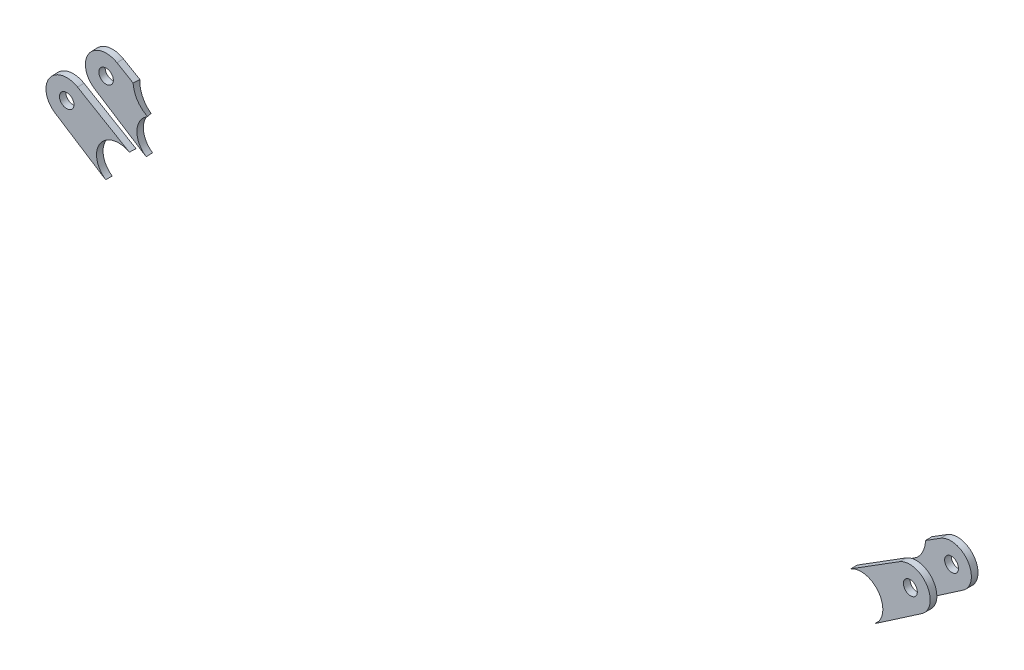
ISO-10303-21;
HEADER;
FILE_DESCRIPTION(('STEP AP214'),'2;1');
FILE_NAME('part.step','',(''),(''),'','','');
FILE_SCHEMA(('AUTOMOTIVE_DESIGN { 1 0 10303 214 1 1 1 1 }'));
ENDSEC;
DATA;
#1=APPLICATION_CONTEXT('core data for automotive mechanical design processes');
#2=APPLICATION_PROTOCOL_DEFINITION('international standard','automotive_design',2000,#1);
#3=PRODUCT_CONTEXT('',#1,'mechanical');
#4=PRODUCT('Part','Part','',(#3));
#5=PRODUCT_RELATED_PRODUCT_CATEGORY('part','',(#4));
#6=PRODUCT_DEFINITION_FORMATION('','',#4);
#7=PRODUCT_DEFINITION_CONTEXT('part definition',#1,'design');
#8=PRODUCT_DEFINITION('design','',#6,#7);
#9=PRODUCT_DEFINITION_SHAPE('','',#8);
#10=(LENGTH_UNIT() NAMED_UNIT(*) SI_UNIT(.MILLI.,.METRE.));
#11=(NAMED_UNIT(*) PLANE_ANGLE_UNIT() SI_UNIT($,.RADIAN.));
#12=(NAMED_UNIT(*) SI_UNIT($,.STERADIAN.) SOLID_ANGLE_UNIT());
#13=UNCERTAINTY_MEASURE_WITH_UNIT(LENGTH_MEASURE(1.E-05),#10,'distance_accuracy_value','');
#14=(GEOMETRIC_REPRESENTATION_CONTEXT(3) GLOBAL_UNCERTAINTY_ASSIGNED_CONTEXT((#13)) GLOBAL_UNIT_ASSIGNED_CONTEXT((#10,
#11,#12)) REPRESENTATION_CONTEXT('',''));
#15=CARTESIAN_POINT('',(0.,0.,0.));
#16=DIRECTION('',(0.,0.,1.));
#17=DIRECTION('',(1.,0.,0.));
#18=AXIS2_PLACEMENT_3D('',#15,#16,#17);
#19=CARTESIAN_POINT('',(-249.692555395701,-2230.20496306954,145.84507016795));
#20=DIRECTION('',(-0.0221981663765211,0.0147987775843204,-0.999644055447503));
#21=DIRECTION('',(0.999753536362772,0.,-0.0222005975174446));
#22=AXIS2_PLACEMENT_3D('',#19,#20,#21);
#23=PLANE('',#22);
#24=CARTESIAN_POINT('',(-220.000000000002,-2250.,144.892668532151));
#25=DIRECTION('',(0.0221981663765211,-0.0147987775843204,0.999644055447503));
#26=DIRECTION('',(-0.831754130568251,0.554502753711993,0.0266788756972608));
#27=AXIS2_PLACEMENT_3D('',#24,#25,#26);
#28=ELLIPSE('',#27,12.7045221054355,12.7);
#29=CARTESIAN_POINT('',(-227.594962639426,-2260.17872990632,144.910636412039));
#30=VERTEX_POINT('',#29);
#31=CARTESIAN_POINT('',(-213.525388794002,-2239.07436913807,144.91063641204));
#32=VERTEX_POINT('',#31);
#33=EDGE_CURVE('E59',#30,#32,#28,.F.);
#34=ORIENTED_EDGE('',*,*,#33,.T.);
#35=DIRECTION('',(0.842362845825228,-0.538250259314545,-0.0266738508852436));
#36=VECTOR('',#35,1.);
#37=CARTESIAN_POINT('',(-212.854050224362,-2239.50333886411,144.889378132441));
#38=LINE('',#37,#36);
#39=CARTESIAN_POINT('',(-243.23111444626,-2220.09310160627,145.851283427056));
#40=VERTEX_POINT('',#39);
#41=EDGE_CURVE('E92',#40,#32,#38,.T.);
#42=ORIENTED_EDGE('',*,*,#41,.F.);
#43=CARTESIAN_POINT('',(-249.692555395701,-2230.20496306954,145.84507016795));
#44=DIRECTION('',(-0.0221981663765211,0.0147987775843204,-0.999644055447503));
#45=DIRECTION('',(0.999753536362772,0.,-0.0222005975174446));
#46=AXIS2_PLACEMENT_3D('',#43,#44,#45);
#47=CIRCLE('',#46,12.0000000000003);
#48=CARTESIAN_POINT('',(-256.541411765852,-2240.05854758567,145.851283427057));
#49=VERTEX_POINT('',#48);
#50=EDGE_CURVE('E98',#49,#40,#47,.T.);
#51=ORIENTED_EDGE('',*,*,#50,.F.);
#52=DIRECTION('',(-0.820832103146355,0.570546373332864,0.0266738508852429));
#53=VECTOR('',#52,1.);
#54=CARTESIAN_POINT('',(-226.940783442501,-2260.63343869132,144.889378132441));
#55=LINE('',#54,#53);
#56=EDGE_CURVE('E103',#30,#49,#55,.T.);
#57=ORIENTED_EDGE('',*,*,#56,.F.);
#58=EDGE_LOOP('',(#34,#42,#51,#57));
#59=FACE_BOUND('',#58,.T.);
#60=CARTESIAN_POINT('',(-249.692555395701,-2230.20496306954,145.84507016795));
#61=DIRECTION('',(-0.0221981663765211,0.0147987775843204,-0.999644055447503));
#62=DIRECTION('',(-0.999753536362772,0.,0.0222005975174446));
#63=AXIS2_PLACEMENT_3D('',#60,#61,#62);
#64=CIRCLE('',#63,4.19999999999987);
#65=CARTESIAN_POINT('',(-253.891520248424,-2230.20496306954,145.938312677523));
#66=VERTEX_POINT('',#65);
#67=EDGE_CURVE('E104',#66,#66,#64,.T.);
#68=ORIENTED_EDGE('',*,*,#67,.T.);
#69=EDGE_LOOP('',(#68));
#70=FACE_BOUND('',#69,.T.);
#71=ADVANCED_FACE('F50',(#59,#70),#23,.F.);
#72=CARTESIAN_POINT('',(-249.77801833625,-2230.14798777584,141.996440554477));
#73=DIRECTION('',(-0.0221981663765211,0.0147987775843204,-0.999644055447503));
#74=DIRECTION('',(0.999753536362772,0.,-0.0222005975174446));
#75=AXIS2_PLACEMENT_3D('',#72,#73,#74);
#76=PLANE('',#75);
#77=DIRECTION('',(-0.820832103146355,0.570546373332864,0.0266738508852429));
#78=VECTOR('',#77,1.);
#79=CARTESIAN_POINT('',(-227.026246383051,-2260.57646339762,141.040748518969));
#80=LINE('',#79,#78);
#81=CARTESIAN_POINT('',(-227.543459904994,-2260.21695711363,141.05755594683));
#82=VERTEX_POINT('',#81);
#83=CARTESIAN_POINT('',(-256.626874706401,-2240.00157229197,142.002653813584));
#84=VERTEX_POINT('',#83);
#85=EDGE_CURVE('E113',#82,#84,#80,.T.);
#86=ORIENTED_EDGE('',*,*,#85,.T.);
#87=CARTESIAN_POINT('',(-249.77801833625,-2230.14798777584,141.996440554477));
#88=DIRECTION('',(-0.0221981663765211,0.0147987775843204,-0.999644055447503));
#89=DIRECTION('',(0.999753536362772,0.,-0.0222005975174446));
#90=AXIS2_PLACEMENT_3D('',#87,#88,#89);
#91=CIRCLE('',#90,12.0000000000003);
#92=CARTESIAN_POINT('',(-243.316577386809,-2220.03612631257,142.002653813583));
#93=VERTEX_POINT('',#92);
#94=EDGE_CURVE('E118',#84,#93,#91,.T.);
#95=ORIENTED_EDGE('',*,*,#94,.T.);
#96=DIRECTION('',(0.842362845825228,-0.538250259314545,-0.0266738508852436));
#97=VECTOR('',#96,1.);
#98=CARTESIAN_POINT('',(-212.939513164911,-2239.44636357041,141.040748518968));
#99=LINE('',#98,#97);
#100=CARTESIAN_POINT('',(-213.470293397096,-2239.10720735165,141.057555946832));
#101=VERTEX_POINT('',#100);
#102=EDGE_CURVE('E109',#93,#101,#99,.T.);
#103=ORIENTED_EDGE('',*,*,#102,.T.);
#104=CARTESIAN_POINT('',(-220.000000000002,-2250.,141.041297657668));
#105=DIRECTION('',(0.0221981663765211,-0.0147987775843204,0.999644055447503));
#106=DIRECTION('',(-0.831754130568251,0.554502753711993,0.0266788756972608));
#107=AXIS2_PLACEMENT_3D('',#104,#105,#106);
#108=ELLIPSE('',#107,12.7045221054355,12.7);
#109=EDGE_CURVE('E53',#82,#101,#108,.F.);
#110=ORIENTED_EDGE('',*,*,#109,.F.);
#111=EDGE_LOOP('',(#86,#95,#103,#110));
#112=FACE_BOUND('',#111,.T.);
#113=CARTESIAN_POINT('',(-249.77801833625,-2230.14798777584,141.996440554477));
#114=DIRECTION('',(-0.0221981663765211,0.0147987775843204,-0.999644055447503));
#115=DIRECTION('',(-0.999753536362772,0.,0.0222005975174446));
#116=AXIS2_PLACEMENT_3D('',#113,#114,#115);
#117=CIRCLE('',#116,4.19999999999987);
#118=CARTESIAN_POINT('',(-253.976983188974,-2230.14798777584,142.08968306405));
#119=VERTEX_POINT('',#118);
#120=EDGE_CURVE('E110',#119,#119,#117,.T.);
#121=ORIENTED_EDGE('',*,*,#120,.F.);
#122=EDGE_LOOP('',(#121));
#123=FACE_BOUND('',#122,.T.);
#124=ADVANCED_FACE('F131',(#112,#123),#76,.T.);
#125=CARTESIAN_POINT('',(-226.940783442501,-2260.63343869132,144.889378132441));
#126=DIRECTION('',(0.570738030845897,0.821132043010578,-0.00051777159223074));
#127=DIRECTION('',(0.821132153078187,-0.570738107349756,0.));
#128=AXIS2_PLACEMENT_3D('',#125,#126,#127);
#129=PLANE('',#128);
#130=CARTESIAN_POINT('',(-219.999999999745,-2249.99999999963,24659.22446767));
#131=DIRECTION('',(-0.570738030845897,-0.821132043010578,0.00051777159223074));
#132=DIRECTION('',(0.000295511978589142,0.000425158902331218,0.99999986595628));
#133=AXIS2_PLACEMENT_3D('',#130,#131,#132);
#134=ELLIPSE('',#133,24528.1900185729,12.7);
#135=EDGE_CURVE('E66',#82,#30,#134,.F.);
#136=ORIENTED_EDGE('',*,*,#135,.T.);
#137=ORIENTED_EDGE('',*,*,#56,.T.);
#138=DIRECTION('',(-0.0221981663765211,0.0147987775843204,-0.999644055447503));
#139=VECTOR('',#138,1.);
#140=CARTESIAN_POINT('',(-256.541411765852,-2240.05854758567,145.851283427057));
#141=LINE('',#140,#139);
#142=EDGE_CURVE('E121',#49,#84,#141,.T.);
#143=ORIENTED_EDGE('',*,*,#142,.T.);
#144=ORIENTED_EDGE('',*,*,#85,.F.);
#145=EDGE_LOOP('',(#136,#137,#143,#144));
#146=FACE_BOUND('',#145,.T.);
#147=ADVANCED_FACE('F127',(#146),#129,.F.);
#148=CARTESIAN_POINT('',(-249.692555395701,-2230.20496306954,145.84507016795));
#149=DIRECTION('',(-0.0221981663765211,0.0147987775843204,-0.999644055447503));
#150=DIRECTION('',(0.999753536362772,0.,-0.0222005975174446));
#151=AXIS2_PLACEMENT_3D('',#148,#149,#150);
#152=CYLINDRICAL_SURFACE('',#151,12.0000000000003);
#153=ORIENTED_EDGE('',*,*,#94,.F.);
#154=ORIENTED_EDGE('',*,*,#142,.F.);
#155=ORIENTED_EDGE('',*,*,#50,.T.);
#156=DIRECTION('',(-0.0221981663765211,0.0147987775843204,-0.999644055447503));
#157=VECTOR('',#156,1.);
#158=CARTESIAN_POINT('',(-243.23111444626,-2220.09310160627,145.851283427056));
#159=LINE('',#158,#157);
#160=EDGE_CURVE('E94',#40,#93,#159,.T.);
#161=ORIENTED_EDGE('',*,*,#160,.T.);
#162=EDGE_LOOP('',(#153,#154,#155,#161));
#163=FACE_BOUND('',#162,.T.);
#164=ADVANCED_FACE('F129',(#163),#152,.T.);
#165=CARTESIAN_POINT('',(-212.854050224362,-2239.50333886411,144.889378132441));
#166=DIRECTION('',(-0.53845341245343,-0.842655121938884,-0.000517771592192865));
#167=DIRECTION('',(-0.842655234891526,0.538453484629738,0.));
#168=AXIS2_PLACEMENT_3D('',#165,#166,#167);
#169=PLANE('',#168);
#170=CARTESIAN_POINT('',(-219.999999999745,-2249.99999999963,24659.2244677046));
#171=DIRECTION('',(0.53845341245343,0.842655121938884,0.000517771592192865));
#172=DIRECTION('',(-0.000278795918058033,-0.00043630294263976,0.99999986595628));
#173=AXIS2_PLACEMENT_3D('',#170,#171,#172);
#174=ELLIPSE('',#173,24528.1900186114,12.7);
#175=EDGE_CURVE('E12',#32,#101,#174,.F.);
#176=ORIENTED_EDGE('',*,*,#175,.T.);
#177=ORIENTED_EDGE('',*,*,#102,.F.);
#178=ORIENTED_EDGE('',*,*,#160,.F.);
#179=ORIENTED_EDGE('',*,*,#41,.T.);
#180=EDGE_LOOP('',(#176,#177,#178,#179));
#181=FACE_BOUND('',#180,.T.);
#182=ADVANCED_FACE('F93',(#181),#169,.F.);
#183=CARTESIAN_POINT('',(-249.692555395701,-2230.20496306954,145.84507016795));
#184=DIRECTION('',(-0.0221981663765211,0.0147987775843204,-0.999644055447503));
#185=DIRECTION('',(0.999753536362772,0.,-0.0222005975174446));
#186=AXIS2_PLACEMENT_3D('',#183,#184,#185);
#187=CYLINDRICAL_SURFACE('',#186,4.19999999999987);
#188=ORIENTED_EDGE('',*,*,#67,.F.);
#189=EDGE_LOOP('',(#188));
#190=FACE_BOUND('',#189,.T.);
#191=ORIENTED_EDGE('',*,*,#120,.T.);
#192=EDGE_LOOP('',(#191));
#193=FACE_BOUND('',#192,.T.);
#194=ADVANCED_FACE('F136',(#190,#193),#187,.F.);
#195=CARTESIAN_POINT('',(-220.000000000002,-2250.,80.000000000002));
#196=DIRECTION('',(0.,0.,1.));
#197=DIRECTION('',(0.,-1.,0.));
#198=AXIS2_PLACEMENT_3D('',#195,#196,#197);
#199=CYLINDRICAL_SURFACE('',#198,12.7);
#200=ORIENTED_EDGE('',*,*,#135,.F.);
#201=ORIENTED_EDGE('',*,*,#109,.T.);
#202=ORIENTED_EDGE('',*,*,#175,.F.);
#203=ORIENTED_EDGE('',*,*,#33,.F.);
#204=EDGE_LOOP('',(#200,#201,#202,#203));
#205=FACE_BOUND('',#204,.T.);
#206=ADVANCED_FACE('F86',(#205),#199,.F.);
#207=CLOSED_SHELL('',(#71,#124,#147,#164,#182,#194,#206));
#208=MANIFOLD_SOLID_BREP('B2',#207);
#209=CARTESIAN_POINT('',(-250.30744460433,-2229.79503693046,118.154929832054));
#210=DIRECTION('',(0.0221981663765211,-0.0147987775843204,0.999644055447503));
#211=DIRECTION('',(-0.999753536362772,0.,0.0222005975174446));
#212=AXIS2_PLACEMENT_3D('',#209,#210,#211);
#213=CYLINDRICAL_SURFACE('',#212,4.19999999999987);
#214=CARTESIAN_POINT('',(-250.30744460433,-2229.79503693046,118.154929832054));
#215=DIRECTION('',(-0.0221981663765211,0.0147987775843204,-0.999644055447503));
#216=DIRECTION('',(-0.999753536362772,0.,0.0222005975174446));
#217=AXIS2_PLACEMENT_3D('',#214,#215,#216);
#218=CIRCLE('',#217,4.19999999999987);
#219=CARTESIAN_POINT('',(-254.506409457054,-2229.79503693046,118.248172341627));
#220=VERTEX_POINT('',#219);
#221=EDGE_CURVE('E268',#220,#220,#218,.T.);
#222=ORIENTED_EDGE('',*,*,#221,.T.);
#223=EDGE_LOOP('',(#222));
#224=FACE_BOUND('',#223,.T.);
#225=CARTESIAN_POINT('',(-250.221981663781,-2229.85201222416,122.003559445527));
#226=DIRECTION('',(-0.0221981663765211,0.0147987775843204,-0.999644055447503));
#227=DIRECTION('',(-0.999753536362772,0.,0.0222005975174446));
#228=AXIS2_PLACEMENT_3D('',#225,#226,#227);
#229=CIRCLE('',#228,4.19999999999987);
#230=CARTESIAN_POINT('',(-254.420946516504,-2229.85201222416,122.0968019551));
#231=VERTEX_POINT('',#230);
#232=EDGE_CURVE('E294',#231,#231,#229,.T.);
#233=ORIENTED_EDGE('',*,*,#232,.F.);
#234=EDGE_LOOP('',(#233));
#235=FACE_BOUND('',#234,.T.);
#236=ADVANCED_FACE('F207',(#224,#235),#213,.F.);
#237=CARTESIAN_POINT('',(-250.30744460433,-2229.79503693046,118.154929832054));
#238=DIRECTION('',(0.0221981663765211,-0.0147987775843204,0.999644055447503));
#239=DIRECTION('',(-0.999753536362772,0.,0.0222005975174446));
#240=AXIS2_PLACEMENT_3D('',#237,#238,#239);
#241=CYLINDRICAL_SURFACE('',#240,12.0000000000003);
#242=CARTESIAN_POINT('',(-250.221981663781,-2229.85201222416,122.003559445527));
#243=DIRECTION('',(-0.0221981663765211,0.0147987775843204,-0.999644055447503));
#244=DIRECTION('',(0.999753536362772,0.,-0.0222005975174446));
#245=AXIS2_PLACEMENT_3D('',#242,#243,#244);
#246=CIRCLE('',#245,12.0000000000003);
#247=CARTESIAN_POINT('',(-257.070838033932,-2239.70559674028,122.009772704634));
#248=VERTEX_POINT('',#247);
#249=CARTESIAN_POINT('',(-243.76054071434,-2219.74015076089,122.009772704633));
#250=VERTEX_POINT('',#249);
#251=EDGE_CURVE('E262',#248,#250,#246,.T.);
#252=ORIENTED_EDGE('',*,*,#251,.T.);
#253=DIRECTION('',(0.0221981663765211,-0.0147987775843204,0.999644055447503));
#254=VECTOR('',#253,1.);
#255=CARTESIAN_POINT('',(-243.846003654889,-2219.68317546719,118.16114309116));
#256=LINE('',#255,#254);
#257=CARTESIAN_POINT('',(-243.846003654889,-2219.68317546719,118.16114309116));
#258=VERTEX_POINT('',#257);
#259=EDGE_CURVE('E271',#258,#250,#256,.T.);
#260=ORIENTED_EDGE('',*,*,#259,.F.);
#261=CARTESIAN_POINT('',(-250.30744460433,-2229.79503693046,118.154929832054));
#262=DIRECTION('',(-0.0221981663765211,0.0147987775843204,-0.999644055447503));
#263=DIRECTION('',(0.999753536362772,0.,-0.0222005975174446));
#264=AXIS2_PLACEMENT_3D('',#261,#262,#263);
#265=CIRCLE('',#264,12.0000000000003);
#266=CARTESIAN_POINT('',(-257.156300974481,-2239.64862144658,118.161143091161));
#267=VERTEX_POINT('',#266);
#268=EDGE_CURVE('E279',#267,#258,#265,.T.);
#269=ORIENTED_EDGE('',*,*,#268,.F.);
#270=DIRECTION('',(0.0221981663765211,-0.0147987775843204,0.999644055447503));
#271=VECTOR('',#270,1.);
#272=CARTESIAN_POINT('',(-257.156300974481,-2239.64862144658,118.161143091161));
#273=LINE('',#272,#271);
#274=EDGE_CURVE('E284',#267,#248,#273,.T.);
#275=ORIENTED_EDGE('',*,*,#274,.T.);
#276=EDGE_LOOP('',(#252,#260,#269,#275));
#277=FACE_BOUND('',#276,.T.);
#278=ADVANCED_FACE('F282',(#277),#241,.T.);
#279=CARTESIAN_POINT('',(-227.555672651131,-2260.22351255224,117.199237796546));
#280=DIRECTION('',(-0.570738030845897,-0.821132043010578,0.00051777159223074));
#281=DIRECTION('',(-0.821132153078187,0.570738107349756,0.));
#282=AXIS2_PLACEMENT_3D('',#279,#280,#281);
#283=PLANE('',#282);
#284=DIRECTION('',(-0.820832103146355,0.570546373332864,0.0266738508852429));
#285=VECTOR('',#284,1.);
#286=CARTESIAN_POINT('',(-227.470209710581,-2260.28048784594,121.047867410019));
#287=LINE('',#286,#285);
#288=CARTESIAN_POINT('',(-227.470209710581,-2260.28048784594,121.047867410019));
#289=VERTEX_POINT('',#288);
#290=EDGE_CURVE('E285',#289,#248,#287,.T.);
#291=ORIENTED_EDGE('',*,*,#290,.T.);
#292=ORIENTED_EDGE('',*,*,#274,.F.);
#293=DIRECTION('',(-0.820832103146355,0.570546373332864,0.0266738508852429));
#294=VECTOR('',#293,1.);
#295=CARTESIAN_POINT('',(-227.555672651131,-2260.22351255224,117.199237796546));
#296=LINE('',#295,#294);
#297=CARTESIAN_POINT('',(-227.555672651131,-2260.22351255224,117.199237796546));
#298=VERTEX_POINT('',#297);
#299=EDGE_CURVE('E278',#298,#267,#296,.T.);
#300=ORIENTED_EDGE('',*,*,#299,.F.);
#301=DIRECTION('',(0.0221981663765211,-0.0147987775843204,0.999644055447503));
#302=VECTOR('',#301,1.);
#303=CARTESIAN_POINT('',(-227.555672651131,-2260.22351255224,117.199237796546));
#304=LINE('',#303,#302);
#305=EDGE_CURVE('E305',#298,#289,#304,.T.);
#306=ORIENTED_EDGE('',*,*,#305,.T.);
#307=EDGE_LOOP('',(#291,#292,#300,#306));
#308=FACE_BOUND('',#307,.T.);
#309=ADVANCED_FACE('F314',(#308),#283,.T.);
#310=CARTESIAN_POINT('',(-213.468939432992,-2239.09341272502,117.199237796545));
#311=DIRECTION('',(0.53845341245343,0.842655121938884,0.000517771592192865));
#312=DIRECTION('',(0.842655234891526,-0.538453484629738,0.));
#313=AXIS2_PLACEMENT_3D('',#310,#311,#312);
#314=PLANE('',#313);
#315=DIRECTION('',(0.842362845825228,-0.538250259314545,-0.0266738508852436));
#316=VECTOR('',#315,1.);
#317=CARTESIAN_POINT('',(-213.468939432992,-2239.09341272502,117.199237796545));
#318=LINE('',#317,#316);
#319=CARTESIAN_POINT('',(-234.35356322023,-2225.74862404532,117.860560103739));
#320=VERTEX_POINT('',#319);
#321=EDGE_CURVE('E274',#258,#320,#318,.T.);
#322=ORIENTED_EDGE('',*,*,#321,.F.);
#323=ORIENTED_EDGE('',*,*,#259,.T.);
#324=DIRECTION('',(0.842362845825228,-0.538250259314545,-0.0266738508852436));
#325=VECTOR('',#324,1.);
#326=CARTESIAN_POINT('',(-213.383476492442,-2239.15038801872,121.047867410018));
#327=LINE('',#326,#325);
#328=CARTESIAN_POINT('',(-234.537538003419,-2225.63343490253,121.717721600712));
#329=VERTEX_POINT('',#328);
#330=EDGE_CURVE('E256',#250,#329,#327,.T.);
#331=ORIENTED_EDGE('',*,*,#330,.T.);
#332=CARTESIAN_POINT('',(-221.173046047443,-2234.16387835954,106.393536067434));
#333=DIRECTION('',(-0.53845341245343,-0.842655121938884,-0.000517771592192865));
#334=DIRECTION('',(-0.286116415927992,0.182249282179549,0.940703245280657));
#335=AXIS2_PLACEMENT_3D('',#332,#333,#334);
#336=ELLIPSE('',#335,30.7382771438212,12.7);
#337=EDGE_CURVE('E292',#320,#329,#336,.F.);
#338=ORIENTED_EDGE('',*,*,#337,.F.);
#339=EDGE_LOOP('',(#322,#323,#331,#338));
#340=FACE_BOUND('',#339,.T.);
#341=ADVANCED_FACE('F272',(#340),#314,.T.);
#342=CARTESIAN_POINT('',(-220.000000000002,-2250.,80.000000000002));
#343=DIRECTION('',(-0.0380831501247217,0.514122526683866,0.856870877806438));
#344=DIRECTION('',(0.,-0.857492925712543,0.514495755427529));
#345=AXIS2_PLACEMENT_3D('',#342,#343,#344);
#346=CYLINDRICAL_SURFACE('',#345,12.7);
#347=CARTESIAN_POINT('',(-220.000000000002,-2250.,80.000000000002));
#348=DIRECTION('',(0.0711793246382173,-0.96092088261587,0.26751553430929));
#349=DIRECTION('',(-0.0197618234209458,0.266784616182913,0.963553547501754));
#350=AXIS2_PLACEMENT_3D('',#347,#348,#349);
#351=ELLIPSE('',#350,47.4738786021954,12.7);
#352=CARTESIAN_POINT('',(-228.019620704173,-2240.15237674557,117.506674297633));
#353=VERTEX_POINT('',#352);
#354=CARTESIAN_POINT('',(-226.27157061495,-2238.95656747104,121.336930665293));
#355=VERTEX_POINT('',#354);
#356=EDGE_CURVE('E211',#353,#355,#351,.F.);
#357=ORIENTED_EDGE('',*,*,#356,.F.);
#358=CARTESIAN_POINT('',(-221.669041506267,-2227.46793966542,117.553433890964));
#359=DIRECTION('',(0.0221981663765211,-0.0147987775843204,0.999644055447503));
#360=DIRECTION('',(-0.107413892332197,0.994067299440669,0.0171014594927545));
#361=AXIS2_PLACEMENT_3D('',#358,#359,#360);
#362=ELLIPSE('',#361,14.9744352504567,12.7);
#363=EDGE_CURVE('E217',#353,#320,#362,.F.);
#364=ORIENTED_EDGE('',*,*,#363,.T.);
#365=ORIENTED_EDGE('',*,*,#337,.T.);
#366=CARTESIAN_POINT('',(-221.841919743499,-2225.13408346278,121.443194228696));
#367=DIRECTION('',(0.0221981663765211,-0.0147987775843204,0.999644055447503));
#368=DIRECTION('',(-0.107413892332197,0.994067299440669,0.0171014594927545));
#369=AXIS2_PLACEMENT_3D('',#366,#367,#368);
#370=ELLIPSE('',#369,14.9744352504567,12.7);
#371=EDGE_CURVE('E264',#355,#329,#370,.F.);
#372=ORIENTED_EDGE('',*,*,#371,.F.);
#373=EDGE_LOOP('',(#357,#364,#365,#372));
#374=FACE_BOUND('',#373,.T.);
#375=ADVANCED_FACE('F324',(#374),#346,.F.);
#376=CARTESIAN_POINT('',(-213.468939432992,-2239.09341272502,117.199237796545));
#377=DIRECTION('',(0.83175413056825,-0.554502753711994,-0.0266788756972608));
#378=DIRECTION('',(-0.554700196225109,-0.832050294337924,0.));
#379=AXIS2_PLACEMENT_3D('',#376,#377,#378);
#380=PLANE('',#379);
#381=DIRECTION('',(-0.554700196225109,-0.832050294337924,0.));
#382=VECTOR('',#381,1.);
#383=CARTESIAN_POINT('',(-213.383476492442,-2239.15038801872,121.047867410018));
#384=LINE('',#383,#382);
#385=CARTESIAN_POINT('',(-227.465785972235,-2260.27385223842,121.047867410019));
#386=VERTEX_POINT('',#385);
#387=EDGE_CURVE('E287',#386,#289,#384,.T.);
#388=ORIENTED_EDGE('',*,*,#387,.T.);
#389=ORIENTED_EDGE('',*,*,#305,.F.);
#390=DIRECTION('',(-0.554700196225109,-0.832050294337924,0.));
#391=VECTOR('',#390,1.);
#392=CARTESIAN_POINT('',(-213.468939432992,-2239.09341272502,117.199237796545));
#393=LINE('',#392,#391);
#394=CARTESIAN_POINT('',(-227.548714539188,-2260.21307538432,117.199237796546));
#395=VERTEX_POINT('',#394);
#396=EDGE_CURVE('E307',#395,#298,#393,.T.);
#397=ORIENTED_EDGE('',*,*,#396,.F.);
#398=CARTESIAN_POINT('',(-220.000000000002,-2250.,140.269777985643));
#399=DIRECTION('',(-0.83175413056825,0.554502753711994,0.0266788756972608));
#400=DIRECTION('',(0.022198166376521,-0.0147987775843204,0.999644055447503));
#401=AXIS2_PLACEMENT_3D('',#398,#399,#400);
#402=ELLIPSE('',#401,476.032054128279,12.7);
#403=EDGE_CURVE('E302',#386,#395,#402,.F.);
#404=ORIENTED_EDGE('',*,*,#403,.F.);
#405=EDGE_LOOP('',(#388,#389,#397,#404));
#406=FACE_BOUND('',#405,.T.);
#407=ADVANCED_FACE('F209',(#406),#380,.T.);
#408=CARTESIAN_POINT('',(-250.221981663781,-2229.85201222416,122.003559445527));
#409=DIRECTION('',(-0.0221981663765211,0.0147987775843204,-0.999644055447503));
#410=DIRECTION('',(0.999753536362772,0.,-0.0222005975174446));
#411=AXIS2_PLACEMENT_3D('',#408,#409,#410);
#412=PLANE('',#411);
#413=CARTESIAN_POINT('',(-220.000000000002,-2250.,121.034176231786));
#414=DIRECTION('',(0.0221981663765211,-0.0147987775843204,0.999644055447503));
#415=DIRECTION('',(-0.831754130568251,0.554502753711993,0.0266788756972608));
#416=AXIS2_PLACEMENT_3D('',#413,#414,#415);
#417=ELLIPSE('',#416,12.7045221054355,12.7);
#418=EDGE_CURVE('E48',#386,#355,#417,.F.);
#419=ORIENTED_EDGE('',*,*,#418,.T.);
#420=ORIENTED_EDGE('',*,*,#371,.T.);
#421=ORIENTED_EDGE('',*,*,#330,.F.);
#422=ORIENTED_EDGE('',*,*,#251,.F.);
#423=ORIENTED_EDGE('',*,*,#290,.F.);
#424=ORIENTED_EDGE('',*,*,#387,.F.);
#425=EDGE_LOOP('',(#419,#420,#421,#422,#423,#424));
#426=FACE_BOUND('',#425,.T.);
#427=ORIENTED_EDGE('',*,*,#232,.T.);
#428=EDGE_LOOP('',(#427));
#429=FACE_BOUND('',#428,.T.);
#430=ADVANCED_FACE('F258',(#426,#429),#412,.F.);
#431=CARTESIAN_POINT('',(-250.30744460433,-2229.79503693046,118.154929832054));
#432=DIRECTION('',(-0.0221981663765211,0.0147987775843204,-0.999644055447503));
#433=DIRECTION('',(0.999753536362772,0.,-0.0222005975174446));
#434=AXIS2_PLACEMENT_3D('',#431,#432,#433);
#435=PLANE('',#434);
#436=ORIENTED_EDGE('',*,*,#221,.F.);
#437=EDGE_LOOP('',(#436));
#438=FACE_BOUND('',#437,.T.);
#439=ORIENTED_EDGE('',*,*,#396,.T.);
#440=ORIENTED_EDGE('',*,*,#299,.T.);
#441=ORIENTED_EDGE('',*,*,#268,.T.);
#442=ORIENTED_EDGE('',*,*,#321,.T.);
#443=ORIENTED_EDGE('',*,*,#363,.F.);
#444=CARTESIAN_POINT('',(-220.000000000002,-2250.,117.182805357303));
#445=DIRECTION('',(0.0221981663765211,-0.0147987775843204,0.999644055447503));
#446=DIRECTION('',(-0.831754130568251,0.554502753711993,0.0266788756972608));
#447=AXIS2_PLACEMENT_3D('',#444,#445,#446);
#448=ELLIPSE('',#447,12.7045221054355,12.7);
#449=EDGE_CURVE('E225',#395,#353,#448,.F.);
#450=ORIENTED_EDGE('',*,*,#449,.F.);
#451=EDGE_LOOP('',(#439,#440,#441,#442,#443,#450));
#452=FACE_BOUND('',#451,.T.);
#453=ADVANCED_FACE('F325',(#438,#452),#435,.T.);
#454=CARTESIAN_POINT('',(-220.000000000002,-2250.,80.000000000002));
#455=DIRECTION('',(0.,0.,1.));
#456=DIRECTION('',(0.,-1.,0.));
#457=AXIS2_PLACEMENT_3D('',#454,#455,#456);
#458=CYLINDRICAL_SURFACE('',#457,12.7);
#459=ORIENTED_EDGE('',*,*,#403,.T.);
#460=ORIENTED_EDGE('',*,*,#449,.T.);
#461=ORIENTED_EDGE('',*,*,#356,.T.);
#462=ORIENTED_EDGE('',*,*,#418,.F.);
#463=EDGE_LOOP('',(#459,#460,#461,#462));
#464=FACE_BOUND('',#463,.T.);
#465=ADVANCED_FACE('F320',(#464),#458,.F.);
#466=CLOSED_SHELL('',(#236,#278,#309,#341,#375,#407,#430,#453,#465));
#467=MANIFOLD_SOLID_BREP('B6',#466);
#468=CARTESIAN_POINT('',(250.30744460433,-2229.79503693046,118.154929832054));
#469=DIRECTION('',(-0.0221981663765211,-0.0147987775843204,0.999644055447503));
#470=DIRECTION('',(0.999753536362772,0.,0.0222005975174446));
#471=AXIS2_PLACEMENT_3D('',#468,#469,#470);
#472=CYLINDRICAL_SURFACE('',#471,4.19999999999987);
#473=CARTESIAN_POINT('',(250.30744460433,-2229.79503693046,118.154929832054));
#474=DIRECTION('',(-0.0221981663765211,-0.0147987775843204,0.999644055447503));
#475=DIRECTION('',(0.999753536362772,0.,0.0222005975174446));
#476=AXIS2_PLACEMENT_3D('',#473,#474,#475);
#477=CIRCLE('',#476,4.19999999999987);
#478=CARTESIAN_POINT('',(254.506409457054,-2229.79503693046,118.248172341627));
#479=VERTEX_POINT('',#478);
#480=EDGE_CURVE('E493',#479,#479,#477,.T.);
#481=ORIENTED_EDGE('',*,*,#480,.F.);
#482=EDGE_LOOP('',(#481));
#483=FACE_BOUND('',#482,.T.);
#484=CARTESIAN_POINT('',(250.221981663781,-2229.85201222416,122.003559445527));
#485=DIRECTION('',(-0.0221981663765211,-0.0147987775843204,0.999644055447503));
#486=DIRECTION('',(0.999753536362772,0.,0.0222005975174446));
#487=AXIS2_PLACEMENT_3D('',#484,#485,#486);
#488=CIRCLE('',#487,4.19999999999987);
#489=CARTESIAN_POINT('',(254.420946516504,-2229.85201222416,122.0968019551));
#490=VERTEX_POINT('',#489);
#491=EDGE_CURVE('E520',#490,#490,#488,.T.);
#492=ORIENTED_EDGE('',*,*,#491,.T.);
#493=EDGE_LOOP('',(#492));
#494=FACE_BOUND('',#493,.T.);
#495=ADVANCED_FACE('F417',(#483,#494),#472,.F.);
#496=CARTESIAN_POINT('',(250.30744460433,-2229.79503693046,118.154929832054));
#497=DIRECTION('',(-0.0221981663765211,-0.0147987775843204,0.999644055447503));
#498=DIRECTION('',(0.999753536362772,0.,0.0222005975174446));
#499=AXIS2_PLACEMENT_3D('',#496,#497,#498);
#500=CYLINDRICAL_SURFACE('',#499,12.0000000000003);
#501=CARTESIAN_POINT('',(250.221981663781,-2229.85201222416,122.003559445527));
#502=DIRECTION('',(-0.0221981663765211,-0.0147987775843204,0.999644055447503));
#503=DIRECTION('',(-0.999753536362772,0.,-0.0222005975174446));
#504=AXIS2_PLACEMENT_3D('',#501,#502,#503);
#505=CIRCLE('',#504,12.0000000000003);
#506=CARTESIAN_POINT('',(257.070838033932,-2239.70559674028,122.009772704634));
#507=VERTEX_POINT('',#506);
#508=CARTESIAN_POINT('',(243.76054071434,-2219.74015076089,122.009772704633));
#509=VERTEX_POINT('',#508);
#510=EDGE_CURVE('E470',#507,#509,#505,.T.);
#511=ORIENTED_EDGE('',*,*,#510,.F.);
#512=DIRECTION('',(-0.0221981663765211,-0.0147987775843204,0.999644055447503));
#513=VECTOR('',#512,1.);
#514=CARTESIAN_POINT('',(257.156300974481,-2239.64862144658,118.161143091161));
#515=LINE('',#514,#513);
#516=CARTESIAN_POINT('',(257.156300974481,-2239.64862144658,118.161143091161));
#517=VERTEX_POINT('',#516);
#518=EDGE_CURVE('E515',#517,#507,#515,.T.);
#519=ORIENTED_EDGE('',*,*,#518,.F.);
#520=CARTESIAN_POINT('',(250.30744460433,-2229.79503693046,118.154929832054));
#521=DIRECTION('',(-0.0221981663765211,-0.0147987775843204,0.999644055447503));
#522=DIRECTION('',(-0.999753536362772,0.,-0.0222005975174446));
#523=AXIS2_PLACEMENT_3D('',#520,#521,#522);
#524=CIRCLE('',#523,12.0000000000003);
#525=CARTESIAN_POINT('',(243.846003654889,-2219.68317546719,118.16114309116));
#526=VERTEX_POINT('',#525);
#527=EDGE_CURVE('E473',#517,#526,#524,.T.);
#528=ORIENTED_EDGE('',*,*,#527,.T.);
#529=DIRECTION('',(-0.0221981663765211,-0.0147987775843204,0.999644055447503));
#530=VECTOR('',#529,1.);
#531=CARTESIAN_POINT('',(243.846003654889,-2219.68317546719,118.16114309116));
#532=LINE('',#531,#530);
#533=EDGE_CURVE('E467',#526,#509,#532,.T.);
#534=ORIENTED_EDGE('',*,*,#533,.T.);
#535=EDGE_LOOP('',(#511,#519,#528,#534));
#536=FACE_BOUND('',#535,.T.);
#537=ADVANCED_FACE('F469',(#536),#500,.T.);
#538=CARTESIAN_POINT('',(227.555672651131,-2260.22351255224,117.199237796546));
#539=DIRECTION('',(0.570738030845897,-0.821132043010578,0.00051777159223074));
#540=DIRECTION('',(0.821132153078187,0.570738107349756,0.));
#541=AXIS2_PLACEMENT_3D('',#538,#539,#540);
#542=PLANE('',#541);
#543=DIRECTION('',(0.820832103146355,0.570546373332864,0.0266738508852429));
#544=VECTOR('',#543,1.);
#545=CARTESIAN_POINT('',(227.470209710581,-2260.28048784594,121.047867410019));
#546=LINE('',#545,#544);
#547=CARTESIAN_POINT('',(227.470209710581,-2260.28048784594,121.047867410019));
#548=VERTEX_POINT('',#547);
#549=EDGE_CURVE('E488',#548,#507,#546,.T.);
#550=ORIENTED_EDGE('',*,*,#549,.F.);
#551=DIRECTION('',(-0.0221981663765211,-0.0147987775843204,0.999644055447503));
#552=VECTOR('',#551,1.);
#553=CARTESIAN_POINT('',(227.555672651131,-2260.22351255224,117.199237796546));
#554=LINE('',#553,#552);
#555=CARTESIAN_POINT('',(227.555672651131,-2260.22351255224,117.199237796546));
#556=VERTEX_POINT('',#555);
#557=EDGE_CURVE('E503',#556,#548,#554,.T.);
#558=ORIENTED_EDGE('',*,*,#557,.F.);
#559=DIRECTION('',(0.820832103146355,0.570546373332864,0.0266738508852429));
#560=VECTOR('',#559,1.);
#561=CARTESIAN_POINT('',(227.555672651131,-2260.22351255224,117.199237796546));
#562=LINE('',#561,#560);
#563=EDGE_CURVE('E478',#556,#517,#562,.T.);
#564=ORIENTED_EDGE('',*,*,#563,.T.);
#565=ORIENTED_EDGE('',*,*,#518,.T.);
#566=EDGE_LOOP('',(#550,#558,#564,#565));
#567=FACE_BOUND('',#566,.T.);
#568=ADVANCED_FACE('F531',(#567),#542,.T.);
#569=CARTESIAN_POINT('',(213.468939432992,-2239.09341272502,117.199237796545));
#570=DIRECTION('',(-0.53845341245343,0.842655121938884,0.000517771592192865));
#571=DIRECTION('',(-0.842655234891526,-0.538453484629738,0.));
#572=AXIS2_PLACEMENT_3D('',#569,#570,#571);
#573=PLANE('',#572);
#574=DIRECTION('',(-0.842362845825228,-0.538250259314545,-0.0266738508852436));
#575=VECTOR('',#574,1.);
#576=CARTESIAN_POINT('',(213.468939432992,-2239.09341272502,117.199237796545));
#577=LINE('',#576,#575);
#578=CARTESIAN_POINT('',(234.35356322023,-2225.74862404532,117.860560103739));
#579=VERTEX_POINT('',#578);
#580=EDGE_CURVE('E504',#526,#579,#577,.T.);
#581=ORIENTED_EDGE('',*,*,#580,.T.);
#582=CARTESIAN_POINT('',(221.173046047443,-2234.16387835954,106.393536067434));
#583=DIRECTION('',(-0.53845341245343,0.842655121938884,0.000517771592192865));
#584=DIRECTION('',(0.286116415927992,0.182249282179549,0.940703245280657));
#585=AXIS2_PLACEMENT_3D('',#582,#583,#584);
#586=ELLIPSE('',#585,30.7382771438212,12.7);
#587=CARTESIAN_POINT('',(234.537538003419,-2225.63343490253,121.717721600712));
#588=VERTEX_POINT('',#587);
#589=EDGE_CURVE('E492',#579,#588,#586,.F.);
#590=ORIENTED_EDGE('',*,*,#589,.T.);
#591=DIRECTION('',(-0.842362845825228,-0.538250259314545,-0.0266738508852436));
#592=VECTOR('',#591,1.);
#593=CARTESIAN_POINT('',(213.383476492442,-2239.15038801872,121.047867410018));
#594=LINE('',#593,#592);
#595=EDGE_CURVE('E486',#509,#588,#594,.T.);
#596=ORIENTED_EDGE('',*,*,#595,.F.);
#597=ORIENTED_EDGE('',*,*,#533,.F.);
#598=EDGE_LOOP('',(#581,#590,#596,#597));
#599=FACE_BOUND('',#598,.T.);
#600=ADVANCED_FACE('F491',(#599),#573,.T.);
#601=CARTESIAN_POINT('',(220.000000000002,-2250.,80.000000000002));
#602=DIRECTION('',(0.0380831501247217,0.514122526683866,0.856870877806438));
#603=DIRECTION('',(0.,-0.857492925712543,0.514495755427529));
#604=AXIS2_PLACEMENT_3D('',#601,#602,#603);
#605=CYLINDRICAL_SURFACE('',#604,12.7);
#606=CARTESIAN_POINT('',(220.000000000002,-2250.,80.000000000002));
#607=DIRECTION('',(0.0711793246382173,0.96092088261587,-0.26751553430929));
#608=DIRECTION('',(0.0197618234209458,0.266784616182913,0.963553547501754));
#609=AXIS2_PLACEMENT_3D('',#606,#607,#608);
#610=ELLIPSE('',#609,47.4738786021954,12.7);
#611=CARTESIAN_POINT('',(228.019620704173,-2240.15237674557,117.506674297633));
#612=VERTEX_POINT('',#611);
#613=CARTESIAN_POINT('',(226.27157061495,-2238.95656747104,121.336930665293));
#614=VERTEX_POINT('',#613);
#615=EDGE_CURVE('E421',#612,#614,#610,.F.);
#616=ORIENTED_EDGE('',*,*,#615,.T.);
#617=CARTESIAN_POINT('',(221.841919743499,-2225.13408346278,121.443194228696));
#618=DIRECTION('',(0.0221981663765211,0.0147987775843204,-0.999644055447503));
#619=DIRECTION('',(0.107413892332197,0.994067299440669,0.0171014594927545));
#620=AXIS2_PLACEMENT_3D('',#617,#618,#619);
#621=ELLIPSE('',#620,14.9744352504567,12.7);
#622=EDGE_CURVE('E499',#614,#588,#621,.F.);
#623=ORIENTED_EDGE('',*,*,#622,.T.);
#624=ORIENTED_EDGE('',*,*,#589,.F.);
#625=CARTESIAN_POINT('',(221.669041506267,-2227.46793966542,117.553433890964));
#626=DIRECTION('',(0.0221981663765211,0.0147987775843204,-0.999644055447503));
#627=DIRECTION('',(0.107413892332197,0.994067299440669,0.0171014594927545));
#628=AXIS2_PLACEMENT_3D('',#625,#626,#627);
#629=ELLIPSE('',#628,14.9744352504567,12.7);
#630=EDGE_CURVE('E427',#612,#579,#629,.F.);
#631=ORIENTED_EDGE('',*,*,#630,.F.);
#632=EDGE_LOOP('',(#616,#623,#624,#631));
#633=FACE_BOUND('',#632,.T.);
#634=ADVANCED_FACE('F538',(#633),#605,.F.);
#635=CARTESIAN_POINT('',(213.468939432992,-2239.09341272502,117.199237796545));
#636=DIRECTION('',(-0.83175413056825,-0.554502753711994,-0.0266788756972608));
#637=DIRECTION('',(0.554700196225109,-0.832050294337924,0.));
#638=AXIS2_PLACEMENT_3D('',#635,#636,#637);
#639=PLANE('',#638);
#640=DIRECTION('',(0.554700196225109,-0.832050294337924,0.));
#641=VECTOR('',#640,1.);
#642=CARTESIAN_POINT('',(213.383476492442,-2239.15038801872,121.047867410018));
#643=LINE('',#642,#641);
#644=CARTESIAN_POINT('',(227.465785972235,-2260.27385223842,121.047867410019));
#645=VERTEX_POINT('',#644);
#646=EDGE_CURVE('E501',#645,#548,#643,.T.);
#647=ORIENTED_EDGE('',*,*,#646,.F.);
#648=CARTESIAN_POINT('',(220.000000000002,-2250.,140.269777985643));
#649=DIRECTION('',(-0.83175413056825,-0.554502753711994,-0.0266788756972608));
#650=DIRECTION('',(-0.022198166376521,-0.0147987775843204,0.999644055447503));
#651=AXIS2_PLACEMENT_3D('',#648,#649,#650);
#652=ELLIPSE('',#651,476.032054128279,12.7);
#653=CARTESIAN_POINT('',(227.548714539188,-2260.21307538432,117.199237796546));
#654=VERTEX_POINT('',#653);
#655=EDGE_CURVE('E506',#645,#654,#652,.F.);
#656=ORIENTED_EDGE('',*,*,#655,.T.);
#657=DIRECTION('',(0.554700196225109,-0.832050294337924,0.));
#658=VECTOR('',#657,1.);
#659=CARTESIAN_POINT('',(213.468939432992,-2239.09341272502,117.199237796545));
#660=LINE('',#659,#658);
#661=EDGE_CURVE('E507',#654,#556,#660,.T.);
#662=ORIENTED_EDGE('',*,*,#661,.T.);
#663=ORIENTED_EDGE('',*,*,#557,.T.);
#664=EDGE_LOOP('',(#647,#656,#662,#663));
#665=FACE_BOUND('',#664,.T.);
#666=ADVANCED_FACE('F419',(#665),#639,.T.);
#667=CARTESIAN_POINT('',(250.221981663781,-2229.85201222416,122.003559445527));
#668=DIRECTION('',(0.0221981663765211,0.0147987775843204,-0.999644055447503));
#669=DIRECTION('',(-0.999753536362772,0.,-0.0222005975174446));
#670=AXIS2_PLACEMENT_3D('',#667,#668,#669);
#671=PLANE('',#670);
#672=CARTESIAN_POINT('',(220.000000000002,-2250.,121.034176231786));
#673=DIRECTION('',(0.0221981663765211,0.0147987775843204,-0.999644055447503));
#674=DIRECTION('',(0.831754130568251,0.554502753711993,0.0266788756972608));
#675=AXIS2_PLACEMENT_3D('',#672,#673,#674);
#676=ELLIPSE('',#675,12.7045221054355,12.7);
#677=EDGE_CURVE('E205',#645,#614,#676,.F.);
#678=ORIENTED_EDGE('',*,*,#677,.F.);
#679=ORIENTED_EDGE('',*,*,#646,.T.);
#680=ORIENTED_EDGE('',*,*,#549,.T.);
#681=ORIENTED_EDGE('',*,*,#510,.T.);
#682=ORIENTED_EDGE('',*,*,#595,.T.);
#683=ORIENTED_EDGE('',*,*,#622,.F.);
#684=EDGE_LOOP('',(#678,#679,#680,#681,#682,#683));
#685=FACE_BOUND('',#684,.T.);
#686=ORIENTED_EDGE('',*,*,#491,.F.);
#687=EDGE_LOOP('',(#686));
#688=FACE_BOUND('',#687,.T.);
#689=ADVANCED_FACE('F483',(#685,#688),#671,.F.);
#690=CARTESIAN_POINT('',(250.30744460433,-2229.79503693046,118.154929832054));
#691=DIRECTION('',(0.0221981663765211,0.0147987775843204,-0.999644055447503));
#692=DIRECTION('',(-0.999753536362772,0.,-0.0222005975174446));
#693=AXIS2_PLACEMENT_3D('',#690,#691,#692);
#694=PLANE('',#693);
#695=ORIENTED_EDGE('',*,*,#480,.T.);
#696=EDGE_LOOP('',(#695));
#697=FACE_BOUND('',#696,.T.);
#698=ORIENTED_EDGE('',*,*,#661,.F.);
#699=CARTESIAN_POINT('',(220.000000000002,-2250.,117.182805357303));
#700=DIRECTION('',(0.0221981663765211,0.0147987775843204,-0.999644055447503));
#701=DIRECTION('',(0.831754130568251,0.554502753711993,0.0266788756972608));
#702=AXIS2_PLACEMENT_3D('',#699,#700,#701);
#703=ELLIPSE('',#702,12.7045221054355,12.7);
#704=EDGE_CURVE('E435',#654,#612,#703,.F.);
#705=ORIENTED_EDGE('',*,*,#704,.T.);
#706=ORIENTED_EDGE('',*,*,#630,.T.);
#707=ORIENTED_EDGE('',*,*,#580,.F.);
#708=ORIENTED_EDGE('',*,*,#527,.F.);
#709=ORIENTED_EDGE('',*,*,#563,.F.);
#710=EDGE_LOOP('',(#698,#705,#706,#707,#708,#709));
#711=FACE_BOUND('',#710,.T.);
#712=ADVANCED_FACE('F527',(#697,#711),#694,.T.);
#713=CARTESIAN_POINT('',(220.000000000002,-2250.,80.000000000002));
#714=DIRECTION('',(0.,0.,1.));
#715=DIRECTION('',(0.,-1.,0.));
#716=AXIS2_PLACEMENT_3D('',#713,#714,#715);
#717=CYLINDRICAL_SURFACE('',#716,12.7);
#718=ORIENTED_EDGE('',*,*,#655,.F.);
#719=ORIENTED_EDGE('',*,*,#677,.T.);
#720=ORIENTED_EDGE('',*,*,#615,.F.);
#721=ORIENTED_EDGE('',*,*,#704,.F.);
#722=EDGE_LOOP('',(#718,#719,#720,#721));
#723=FACE_BOUND('',#722,.T.);
#724=ADVANCED_FACE('F554',(#723),#717,.F.);
#725=CLOSED_SHELL('',(#495,#537,#568,#600,#634,#666,#689,#712,#724));
#726=MANIFOLD_SOLID_BREP('B42',#725);
#727=CARTESIAN_POINT('',(249.692555395701,-2230.20496306954,145.84507016795));
#728=DIRECTION('',(0.0221981663765211,0.0147987775843204,-0.999644055447503));
#729=DIRECTION('',(-0.999753536362772,0.,-0.0222005975174446));
#730=AXIS2_PLACEMENT_3D('',#727,#728,#729);
#731=PLANE('',#730);
#732=CARTESIAN_POINT('',(220.000000000002,-2250.,144.892668532151));
#733=DIRECTION('',(0.0221981663765211,0.0147987775843204,-0.999644055447503));
#734=DIRECTION('',(0.831754130568251,0.554502753711993,0.0266788756972608));
#735=AXIS2_PLACEMENT_3D('',#732,#733,#734);
#736=ELLIPSE('',#735,12.7045221054355,12.7);
#737=CARTESIAN_POINT('',(227.594962639426,-2260.17872990632,144.910636412039));
#738=VERTEX_POINT('',#737);
#739=CARTESIAN_POINT('',(213.525388794002,-2239.07436913807,144.91063641204));
#740=VERTEX_POINT('',#739);
#741=EDGE_CURVE('E627',#738,#740,#736,.F.);
#742=ORIENTED_EDGE('',*,*,#741,.F.);
#743=DIRECTION('',(0.820832103146355,0.570546373332864,0.0266738508852429));
#744=VECTOR('',#743,1.);
#745=CARTESIAN_POINT('',(226.940783442501,-2260.63343869132,144.889378132441));
#746=LINE('',#745,#744);
#747=CARTESIAN_POINT('',(256.541411765852,-2240.05854758567,145.851283427057));
#748=VERTEX_POINT('',#747);
#749=EDGE_CURVE('E672',#738,#748,#746,.T.);
#750=ORIENTED_EDGE('',*,*,#749,.T.);
#751=CARTESIAN_POINT('',(249.692555395701,-2230.20496306954,145.84507016795));
#752=DIRECTION('',(-0.0221981663765211,-0.0147987775843204,0.999644055447503));
#753=DIRECTION('',(-0.999753536362772,0.,-0.0222005975174446));
#754=AXIS2_PLACEMENT_3D('',#751,#752,#753);
#755=CIRCLE('',#754,12.0000000000003);
#756=CARTESIAN_POINT('',(243.23111444626,-2220.09310160627,145.851283427056));
#757=VERTEX_POINT('',#756);
#758=EDGE_CURVE('E668',#748,#757,#755,.T.);
#759=ORIENTED_EDGE('',*,*,#758,.T.);
#760=DIRECTION('',(-0.842362845825228,-0.538250259314545,-0.0266738508852436));
#761=VECTOR('',#760,1.);
#762=CARTESIAN_POINT('',(212.854050224362,-2239.50333886411,144.889378132441));
#763=LINE('',#762,#761);
#764=EDGE_CURVE('E663',#757,#740,#763,.T.);
#765=ORIENTED_EDGE('',*,*,#764,.T.);
#766=EDGE_LOOP('',(#742,#750,#759,#765));
#767=FACE_BOUND('',#766,.T.);
#768=CARTESIAN_POINT('',(249.692555395701,-2230.20496306954,145.84507016795));
#769=DIRECTION('',(-0.0221981663765211,-0.0147987775843204,0.999644055447503));
#770=DIRECTION('',(0.999753536362772,0.,0.0222005975174446));
#771=AXIS2_PLACEMENT_3D('',#768,#769,#770);
#772=CIRCLE('',#771,4.19999999999987);
#773=CARTESIAN_POINT('',(253.891520248424,-2230.20496306954,145.938312677523));
#774=VERTEX_POINT('',#773);
#775=EDGE_CURVE('E681',#774,#774,#772,.T.);
#776=ORIENTED_EDGE('',*,*,#775,.F.);
#777=EDGE_LOOP('',(#776));
#778=FACE_BOUND('',#777,.T.);
#779=ADVANCED_FACE('F618',(#767,#778),#731,.F.);
#780=CARTESIAN_POINT('',(249.77801833625,-2230.14798777584,141.996440554477));
#781=DIRECTION('',(0.0221981663765211,0.0147987775843204,-0.999644055447503));
#782=DIRECTION('',(-0.999753536362772,0.,-0.0222005975174446));
#783=AXIS2_PLACEMENT_3D('',#780,#781,#782);
#784=PLANE('',#783);
#785=DIRECTION('',(0.820832103146355,0.570546373332864,0.0266738508852429));
#786=VECTOR('',#785,1.);
#787=CARTESIAN_POINT('',(227.026246383051,-2260.57646339762,141.040748518969));
#788=LINE('',#787,#786);
#789=CARTESIAN_POINT('',(227.543459904994,-2260.21695711363,141.05755594683));
#790=VERTEX_POINT('',#789);
#791=CARTESIAN_POINT('',(256.626874706401,-2240.00157229197,142.002653813584));
#792=VERTEX_POINT('',#791);
#793=EDGE_CURVE('E675',#790,#792,#788,.T.);
#794=ORIENTED_EDGE('',*,*,#793,.F.);
#795=CARTESIAN_POINT('',(220.000000000002,-2250.,141.041297657668));
#796=DIRECTION('',(0.0221981663765211,0.0147987775843204,-0.999644055447503));
#797=DIRECTION('',(0.831754130568251,0.554502753711993,0.0266788756972608));
#798=AXIS2_PLACEMENT_3D('',#795,#796,#797);
#799=ELLIPSE('',#798,12.7045221054355,12.7);
#800=CARTESIAN_POINT('',(213.470293397096,-2239.10720735165,141.057555946832));
#801=VERTEX_POINT('',#800);
#802=EDGE_CURVE('E621',#790,#801,#799,.F.);
#803=ORIENTED_EDGE('',*,*,#802,.T.);
#804=DIRECTION('',(-0.842362845825228,-0.538250259314545,-0.0266738508852436));
#805=VECTOR('',#804,1.);
#806=CARTESIAN_POINT('',(212.939513164911,-2239.44636357041,141.040748518968));
#807=LINE('',#806,#805);
#808=CARTESIAN_POINT('',(243.316577386809,-2220.03612631257,142.002653813583));
#809=VERTEX_POINT('',#808);
#810=EDGE_CURVE('E665',#809,#801,#807,.T.);
#811=ORIENTED_EDGE('',*,*,#810,.F.);
#812=CARTESIAN_POINT('',(249.77801833625,-2230.14798777584,141.996440554477));
#813=DIRECTION('',(-0.0221981663765211,-0.0147987775843204,0.999644055447503));
#814=DIRECTION('',(-0.999753536362772,0.,-0.0222005975174446));
#815=AXIS2_PLACEMENT_3D('',#812,#813,#814);
#816=CIRCLE('',#815,12.0000000000003);
#817=EDGE_CURVE('E691',#792,#809,#816,.T.);
#818=ORIENTED_EDGE('',*,*,#817,.F.);
#819=EDGE_LOOP('',(#794,#803,#811,#818));
#820=FACE_BOUND('',#819,.T.);
#821=CARTESIAN_POINT('',(249.77801833625,-2230.14798777584,141.996440554477));
#822=DIRECTION('',(-0.0221981663765211,-0.0147987775843204,0.999644055447503));
#823=DIRECTION('',(0.999753536362772,0.,0.0222005975174446));
#824=AXIS2_PLACEMENT_3D('',#821,#822,#823);
#825=CIRCLE('',#824,4.19999999999987);
#826=CARTESIAN_POINT('',(253.976983188974,-2230.14798777584,142.08968306405));
#827=VERTEX_POINT('',#826);
#828=EDGE_CURVE('E671',#827,#827,#825,.T.);
#829=ORIENTED_EDGE('',*,*,#828,.T.);
#830=EDGE_LOOP('',(#829));
#831=FACE_BOUND('',#830,.T.);
#832=ADVANCED_FACE('F701',(#820,#831),#784,.T.);
#833=CARTESIAN_POINT('',(226.940783442501,-2260.63343869132,144.889378132441));
#834=DIRECTION('',(-0.570738030845897,0.821132043010578,-0.00051777159223074));
#835=DIRECTION('',(-0.821132153078187,-0.570738107349756,0.));
#836=AXIS2_PLACEMENT_3D('',#833,#834,#835);
#837=PLANE('',#836);
#838=CARTESIAN_POINT('',(219.999999999745,-2249.99999999963,24659.22446767));
#839=DIRECTION('',(-0.570738030845897,0.821132043010578,-0.00051777159223074));
#840=DIRECTION('',(-0.000295511978589142,0.000425158902331218,0.99999986595628));
#841=AXIS2_PLACEMENT_3D('',#838,#839,#840);
#842=ELLIPSE('',#841,24528.1900185729,12.7);
#843=EDGE_CURVE('E654',#790,#738,#842,.F.);
#844=ORIENTED_EDGE('',*,*,#843,.F.);
#845=ORIENTED_EDGE('',*,*,#793,.T.);
#846=DIRECTION('',(0.0221981663765211,0.0147987775843204,-0.999644055447503));
#847=VECTOR('',#846,1.);
#848=CARTESIAN_POINT('',(256.541411765852,-2240.05854758567,145.851283427057));
#849=LINE('',#848,#847);
#850=EDGE_CURVE('E688',#748,#792,#849,.T.);
#851=ORIENTED_EDGE('',*,*,#850,.F.);
#852=ORIENTED_EDGE('',*,*,#749,.F.);
#853=EDGE_LOOP('',(#844,#845,#851,#852));
#854=FACE_BOUND('',#853,.T.);
#855=ADVANCED_FACE('F698',(#854),#837,.F.);
#856=CARTESIAN_POINT('',(249.692555395701,-2230.20496306954,145.84507016795));
#857=DIRECTION('',(0.0221981663765211,0.0147987775843204,-0.999644055447503));
#858=DIRECTION('',(-0.999753536362772,0.,-0.0222005975174446));
#859=AXIS2_PLACEMENT_3D('',#856,#857,#858);
#860=CYLINDRICAL_SURFACE('',#859,12.0000000000003);
#861=ORIENTED_EDGE('',*,*,#817,.T.);
#862=DIRECTION('',(0.0221981663765211,0.0147987775843204,-0.999644055447503));
#863=VECTOR('',#862,1.);
#864=CARTESIAN_POINT('',(243.23111444626,-2220.09310160627,145.851283427056));
#865=LINE('',#864,#863);
#866=EDGE_CURVE('E686',#757,#809,#865,.T.);
#867=ORIENTED_EDGE('',*,*,#866,.F.);
#868=ORIENTED_EDGE('',*,*,#758,.F.);
#869=ORIENTED_EDGE('',*,*,#850,.T.);
#870=EDGE_LOOP('',(#861,#867,#868,#869));
#871=FACE_BOUND('',#870,.T.);
#872=ADVANCED_FACE('F700',(#871),#860,.T.);
#873=CARTESIAN_POINT('',(212.854050224362,-2239.50333886411,144.889378132441));
#874=DIRECTION('',(0.53845341245343,-0.842655121938884,-0.000517771592192865));
#875=DIRECTION('',(0.842655234891526,0.538453484629738,0.));
#876=AXIS2_PLACEMENT_3D('',#873,#874,#875);
#877=PLANE('',#876);
#878=CARTESIAN_POINT('',(219.999999999745,-2249.99999999963,24659.2244677046));
#879=DIRECTION('',(0.53845341245343,-0.842655121938884,-0.000517771592192865));
#880=DIRECTION('',(0.000278795918058033,-0.00043630294263976,0.99999986595628));
#881=AXIS2_PLACEMENT_3D('',#878,#879,#880);
#882=ELLIPSE('',#881,24528.1900186114,12.7);
#883=EDGE_CURVE('E415',#740,#801,#882,.F.);
#884=ORIENTED_EDGE('',*,*,#883,.F.);
#885=ORIENTED_EDGE('',*,*,#764,.F.);
#886=ORIENTED_EDGE('',*,*,#866,.T.);
#887=ORIENTED_EDGE('',*,*,#810,.T.);
#888=EDGE_LOOP('',(#884,#885,#886,#887));
#889=FACE_BOUND('',#888,.T.);
#890=ADVANCED_FACE('F661',(#889),#877,.F.);
#891=CARTESIAN_POINT('',(249.692555395701,-2230.20496306954,145.84507016795));
#892=DIRECTION('',(0.0221981663765211,0.0147987775843204,-0.999644055447503));
#893=DIRECTION('',(-0.999753536362772,0.,-0.0222005975174446));
#894=AXIS2_PLACEMENT_3D('',#891,#892,#893);
#895=CYLINDRICAL_SURFACE('',#894,4.19999999999987);
#896=ORIENTED_EDGE('',*,*,#775,.T.);
#897=EDGE_LOOP('',(#896));
#898=FACE_BOUND('',#897,.T.);
#899=ORIENTED_EDGE('',*,*,#828,.F.);
#900=EDGE_LOOP('',(#899));
#901=FACE_BOUND('',#900,.T.);
#902=ADVANCED_FACE('F706',(#898,#901),#895,.F.);
#903=CARTESIAN_POINT('',(220.000000000002,-2250.,80.000000000002));
#904=DIRECTION('',(0.,0.,1.));
#905=DIRECTION('',(0.,-1.,0.));
#906=AXIS2_PLACEMENT_3D('',#903,#904,#905);
#907=CYLINDRICAL_SURFACE('',#906,12.7);
#908=ORIENTED_EDGE('',*,*,#843,.T.);
#909=ORIENTED_EDGE('',*,*,#741,.T.);
#910=ORIENTED_EDGE('',*,*,#883,.T.);
#911=ORIENTED_EDGE('',*,*,#802,.F.);
#912=EDGE_LOOP('',(#908,#909,#910,#911));
#913=FACE_BOUND('',#912,.T.);
#914=ADVANCED_FACE('F653',(#913),#907,.F.);
#915=CLOSED_SHELL('',(#779,#832,#855,#872,#890,#902,#914));
#916=MANIFOLD_SOLID_BREP('B199',#915);
#917=ADVANCED_BREP_SHAPE_REPRESENTATION('',(#18,#208,#467,#726,#916),#14);
#918=SHAPE_DEFINITION_REPRESENTATION(#9,#917);
ENDSEC;
END-ISO-10303-21;
